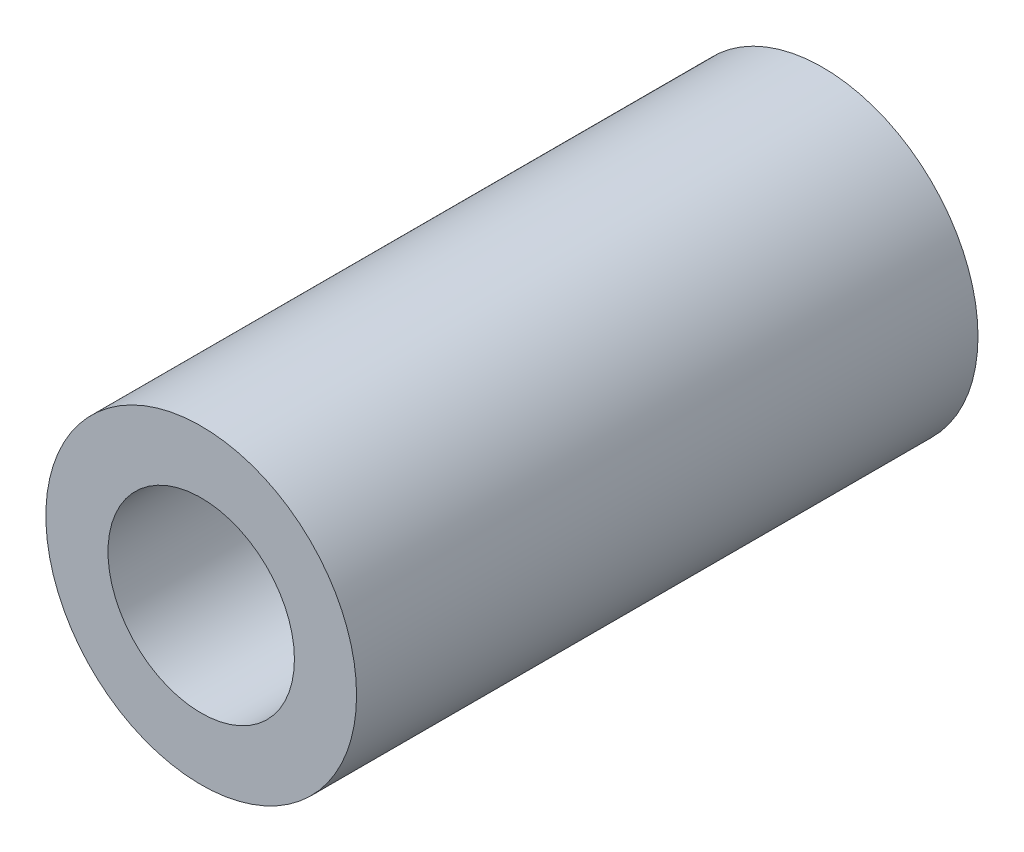
ISO-10303-21;
HEADER;
FILE_DESCRIPTION(('STEP AP214'),'2;1');
FILE_NAME('part.step','',(''),(''),'','','');
FILE_SCHEMA(('AUTOMOTIVE_DESIGN { 1 0 10303 214 1 1 1 1 }'));
ENDSEC;
DATA;
#1=APPLICATION_CONTEXT('core data for automotive mechanical design processes');
#2=APPLICATION_PROTOCOL_DEFINITION('international standard','automotive_design',2000,#1);
#3=PRODUCT_CONTEXT('',#1,'mechanical');
#4=PRODUCT('Part','Part','',(#3));
#5=PRODUCT_RELATED_PRODUCT_CATEGORY('part','',(#4));
#6=PRODUCT_DEFINITION_FORMATION('','',#4);
#7=PRODUCT_DEFINITION_CONTEXT('part definition',#1,'design');
#8=PRODUCT_DEFINITION('design','',#6,#7);
#9=PRODUCT_DEFINITION_SHAPE('','',#8);
#10=(LENGTH_UNIT() NAMED_UNIT(*) SI_UNIT(.MILLI.,.METRE.));
#11=(NAMED_UNIT(*) PLANE_ANGLE_UNIT() SI_UNIT($,.RADIAN.));
#12=(NAMED_UNIT(*) SI_UNIT($,.STERADIAN.) SOLID_ANGLE_UNIT());
#13=UNCERTAINTY_MEASURE_WITH_UNIT(LENGTH_MEASURE(1.E-05),#10,'distance_accuracy_value','');
#14=(GEOMETRIC_REPRESENTATION_CONTEXT(3) GLOBAL_UNCERTAINTY_ASSIGNED_CONTEXT((#13)) GLOBAL_UNIT_ASSIGNED_CONTEXT((#10,
#11,#12)) REPRESENTATION_CONTEXT('',''));
#15=CARTESIAN_POINT('',(0.,0.,0.));
#16=DIRECTION('',(0.,0.,1.));
#17=DIRECTION('',(1.,0.,0.));
#18=AXIS2_PLACEMENT_3D('',#15,#16,#17);
#19=CARTESIAN_POINT('',(0.,0.,15.));
#20=DIRECTION('',(0.,0.,1.));
#21=DIRECTION('',(1.,0.,0.));
#22=AXIS2_PLACEMENT_3D('',#19,#20,#21);
#23=PLANE('',#22);
#24=CARTESIAN_POINT('',(0.,0.,15.));
#25=DIRECTION('',(0.,0.,1.));
#26=DIRECTION('',(1.,0.,0.));
#27=AXIS2_PLACEMENT_3D('',#24,#25,#26);
#28=CIRCLE('',#27,7.5);
#29=CARTESIAN_POINT('',(7.5,0.,15.));
#30=VERTEX_POINT('',#29);
#31=EDGE_CURVE('E10',#30,#30,#28,.T.);
#32=ORIENTED_EDGE('',*,*,#31,.T.);
#33=EDGE_LOOP('',(#32));
#34=FACE_BOUND('',#33,.T.);
#35=CARTESIAN_POINT('',(0.,0.,15.));
#36=DIRECTION('',(0.,0.,1.));
#37=DIRECTION('',(1.,0.,0.));
#38=AXIS2_PLACEMENT_3D('',#35,#36,#37);
#39=CIRCLE('',#38,4.5);
#40=CARTESIAN_POINT('',(4.5,0.,15.));
#41=VERTEX_POINT('',#40);
#42=EDGE_CURVE('E50',#41,#41,#39,.T.);
#43=ORIENTED_EDGE('',*,*,#42,.F.);
#44=EDGE_LOOP('',(#43));
#45=FACE_BOUND('',#44,.T.);
#46=ADVANCED_FACE('F37',(#34,#45),#23,.T.);
#47=CARTESIAN_POINT('',(0.,0.,-15.));
#48=DIRECTION('',(0.,0.,1.));
#49=DIRECTION('',(1.,0.,0.));
#50=AXIS2_PLACEMENT_3D('',#47,#48,#49);
#51=PLANE('',#50);
#52=CARTESIAN_POINT('',(0.,0.,-15.));
#53=DIRECTION('',(0.,0.,1.));
#54=DIRECTION('',(1.,0.,0.));
#55=AXIS2_PLACEMENT_3D('',#52,#53,#54);
#56=CIRCLE('',#55,7.5);
#57=CARTESIAN_POINT('',(7.5,0.,-15.));
#58=VERTEX_POINT('',#57);
#59=EDGE_CURVE('E41',#58,#58,#56,.T.);
#60=ORIENTED_EDGE('',*,*,#59,.F.);
#61=EDGE_LOOP('',(#60));
#62=FACE_BOUND('',#61,.T.);
#63=CARTESIAN_POINT('',(0.,0.,-15.));
#64=DIRECTION('',(0.,0.,1.));
#65=DIRECTION('',(1.,0.,0.));
#66=AXIS2_PLACEMENT_3D('',#63,#64,#65);
#67=CIRCLE('',#66,4.5);
#68=CARTESIAN_POINT('',(4.5,0.,-15.));
#69=VERTEX_POINT('',#68);
#70=EDGE_CURVE('E52',#69,#69,#67,.T.);
#71=ORIENTED_EDGE('',*,*,#70,.T.);
#72=EDGE_LOOP('',(#71));
#73=FACE_BOUND('',#72,.T.);
#74=ADVANCED_FACE('F64',(#62,#73),#51,.F.);
#75=CARTESIAN_POINT('',(0.,0.,15.));
#76=DIRECTION('',(0.,0.,-1.));
#77=DIRECTION('',(-1.,0.,0.));
#78=AXIS2_PLACEMENT_3D('',#75,#76,#77);
#79=CYLINDRICAL_SURFACE('',#78,7.5);
#80=ORIENTED_EDGE('',*,*,#31,.F.);
#81=EDGE_LOOP('',(#80));
#82=FACE_BOUND('',#81,.T.);
#83=ORIENTED_EDGE('',*,*,#59,.T.);
#84=EDGE_LOOP('',(#83));
#85=FACE_BOUND('',#84,.T.);
#86=ADVANCED_FACE('F39',(#82,#85),#79,.T.);
#87=CARTESIAN_POINT('',(0.,0.,15.));
#88=DIRECTION('',(0.,0.,-1.));
#89=DIRECTION('',(-1.,0.,0.));
#90=AXIS2_PLACEMENT_3D('',#87,#88,#89);
#91=CYLINDRICAL_SURFACE('',#90,4.5);
#92=ORIENTED_EDGE('',*,*,#42,.T.);
#93=EDGE_LOOP('',(#92));
#94=FACE_BOUND('',#93,.T.);
#95=ORIENTED_EDGE('',*,*,#70,.F.);
#96=EDGE_LOOP('',(#95));
#97=FACE_BOUND('',#96,.T.);
#98=ADVANCED_FACE('F60',(#94,#97),#91,.F.);
#99=CLOSED_SHELL('',(#46,#74,#86,#98));
#100=MANIFOLD_SOLID_BREP('B2',#99);
#101=ADVANCED_BREP_SHAPE_REPRESENTATION('',(#18,#100),#14);
#102=SHAPE_DEFINITION_REPRESENTATION(#9,#101);
ENDSEC;
END-ISO-10303-21;
